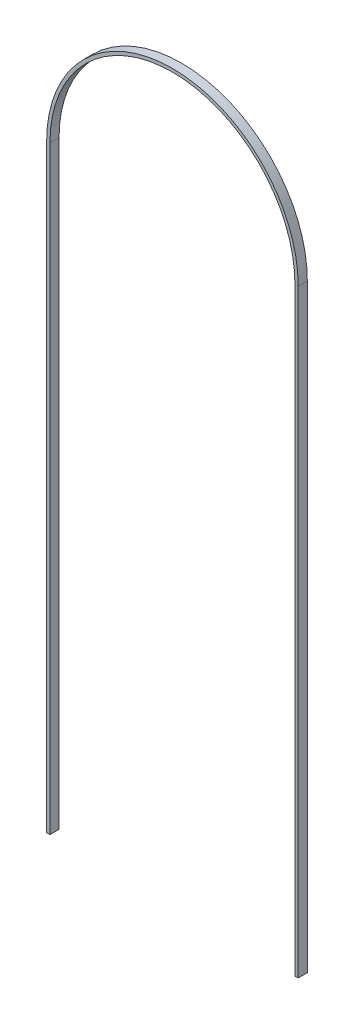
ISO-10303-21;
HEADER;
FILE_DESCRIPTION(('STEP AP214'),'2;1');
FILE_NAME('part.step','',(''),(''),'','','');
FILE_SCHEMA(('AUTOMOTIVE_DESIGN { 1 0 10303 214 1 1 1 1 }'));
ENDSEC;
DATA;
#1=APPLICATION_CONTEXT('core data for automotive mechanical design processes');
#2=APPLICATION_PROTOCOL_DEFINITION('international standard','automotive_design',2000,#1);
#3=PRODUCT_CONTEXT('',#1,'mechanical');
#4=PRODUCT('Part','Part','',(#3));
#5=PRODUCT_RELATED_PRODUCT_CATEGORY('part','',(#4));
#6=PRODUCT_DEFINITION_FORMATION('','',#4);
#7=PRODUCT_DEFINITION_CONTEXT('part definition',#1,'design');
#8=PRODUCT_DEFINITION('design','',#6,#7);
#9=PRODUCT_DEFINITION_SHAPE('','',#8);
#10=(LENGTH_UNIT() NAMED_UNIT(*) SI_UNIT(.MILLI.,.METRE.));
#11=(NAMED_UNIT(*) PLANE_ANGLE_UNIT() SI_UNIT($,.RADIAN.));
#12=(NAMED_UNIT(*) SI_UNIT($,.STERADIAN.) SOLID_ANGLE_UNIT());
#13=UNCERTAINTY_MEASURE_WITH_UNIT(LENGTH_MEASURE(1.E-05),#10,'distance_accuracy_value','');
#14=(GEOMETRIC_REPRESENTATION_CONTEXT(3) GLOBAL_UNCERTAINTY_ASSIGNED_CONTEXT((#13)) GLOBAL_UNIT_ASSIGNED_CONTEXT((#10,
#11,#12)) REPRESENTATION_CONTEXT('',''));
#15=CARTESIAN_POINT('',(0.,0.,0.));
#16=DIRECTION('',(0.,0.,1.));
#17=DIRECTION('',(1.,0.,0.));
#18=AXIS2_PLACEMENT_3D('',#15,#16,#17);
#19=CARTESIAN_POINT('',(0.,0.,70.));
#20=DIRECTION('',(0.,0.,-1.));
#21=DIRECTION('',(-1.,0.,0.));
#22=AXIS2_PLACEMENT_3D('',#19,#20,#21);
#23=CYLINDRICAL_SURFACE('',#22,940.);
#24=CARTESIAN_POINT('',(0.,0.,0.));
#25=DIRECTION('',(0.,0.,1.));
#26=DIRECTION('',(1.,0.,0.));
#27=AXIS2_PLACEMENT_3D('',#24,#25,#26);
#28=CIRCLE('',#27,940.);
#29=CARTESIAN_POINT('',(940.,0.,0.));
#30=VERTEX_POINT('',#29);
#31=CARTESIAN_POINT('',(-940.,1.15116799119851E-13,0.));
#32=VERTEX_POINT('',#31);
#33=EDGE_CURVE('E207',#30,#32,#28,.T.);
#34=ORIENTED_EDGE('',*,*,#33,.F.);
#35=DIRECTION('',(0.,0.,-1.));
#36=VECTOR('',#35,1.);
#37=CARTESIAN_POINT('',(940.,0.,70.));
#38=LINE('',#37,#36);
#39=CARTESIAN_POINT('',(940.,0.,70.));
#40=VERTEX_POINT('',#39);
#41=EDGE_CURVE('E13',#40,#30,#38,.T.);
#42=ORIENTED_EDGE('',*,*,#41,.F.);
#43=CARTESIAN_POINT('',(0.,0.,70.));
#44=DIRECTION('',(0.,0.,1.));
#45=DIRECTION('',(1.,0.,0.));
#46=AXIS2_PLACEMENT_3D('',#43,#44,#45);
#47=CIRCLE('',#46,940.);
#48=CARTESIAN_POINT('',(-940.,1.15116799119851E-13,70.));
#49=VERTEX_POINT('',#48);
#50=EDGE_CURVE('E223',#40,#49,#47,.T.);
#51=ORIENTED_EDGE('',*,*,#50,.T.);
#52=DIRECTION('',(0.,0.,-1.));
#53=VECTOR('',#52,1.);
#54=CARTESIAN_POINT('',(-940.,1.15116799119851E-13,70.));
#55=LINE('',#54,#53);
#56=EDGE_CURVE('E112',#49,#32,#55,.T.);
#57=ORIENTED_EDGE('',*,*,#56,.T.);
#58=EDGE_LOOP('',(#34,#42,#51,#57));
#59=FACE_BOUND('',#58,.T.);
#60=ADVANCED_FACE('F109',(#59),#23,.F.);
#61=CARTESIAN_POINT('',(940.,0.,70.));
#62=DIRECTION('',(1.,0.,0.));
#63=DIRECTION('',(0.,1.,0.));
#64=AXIS2_PLACEMENT_3D('',#61,#62,#63);
#65=PLANE('',#64);
#66=DIRECTION('',(0.,-1.,0.));
#67=VECTOR('',#66,1.);
#68=CARTESIAN_POINT('',(940.,0.,0.));
#69=LINE('',#68,#67);
#70=CARTESIAN_POINT('',(940.000000000001,-4597.,0.));
#71=VERTEX_POINT('',#70);
#72=EDGE_CURVE('E154',#30,#71,#69,.T.);
#73=ORIENTED_EDGE('',*,*,#72,.T.);
#74=DIRECTION('',(0.,0.,-1.));
#75=VECTOR('',#74,1.);
#76=CARTESIAN_POINT('',(940.000000000001,-4597.,70.));
#77=LINE('',#76,#75);
#78=CARTESIAN_POINT('',(940.000000000001,-4597.,70.));
#79=VERTEX_POINT('',#78);
#80=EDGE_CURVE('E118',#79,#71,#77,.T.);
#81=ORIENTED_EDGE('',*,*,#80,.F.);
#82=DIRECTION('',(0.,-1.,0.));
#83=VECTOR('',#82,1.);
#84=CARTESIAN_POINT('',(940.,0.,70.));
#85=LINE('',#84,#83);
#86=EDGE_CURVE('E185',#40,#79,#85,.T.);
#87=ORIENTED_EDGE('',*,*,#86,.F.);
#88=ORIENTED_EDGE('',*,*,#41,.T.);
#89=EDGE_LOOP('',(#73,#81,#87,#88));
#90=FACE_BOUND('',#89,.T.);
#91=ADVANCED_FACE('F263',(#90),#65,.F.);
#92=CARTESIAN_POINT('',(940.000000000001,-4597.,70.));
#93=DIRECTION('',(0.,1.,0.));
#94=DIRECTION('',(0.,0.,1.));
#95=AXIS2_PLACEMENT_3D('',#92,#93,#94);
#96=PLANE('',#95);
#97=DIRECTION('',(1.,0.,0.));
#98=VECTOR('',#97,1.);
#99=CARTESIAN_POINT('',(940.000000000001,-4597.,0.));
#100=LINE('',#99,#98);
#101=CARTESIAN_POINT('',(965.000000000001,-4597.,0.));
#102=VERTEX_POINT('',#101);
#103=EDGE_CURVE('E192',#71,#102,#100,.T.);
#104=ORIENTED_EDGE('',*,*,#103,.T.);
#105=DIRECTION('',(0.,0.,-1.));
#106=VECTOR('',#105,1.);
#107=CARTESIAN_POINT('',(965.000000000001,-4597.,70.));
#108=LINE('',#107,#106);
#109=CARTESIAN_POINT('',(965.000000000001,-4597.,70.));
#110=VERTEX_POINT('',#109);
#111=EDGE_CURVE('E189',#110,#102,#108,.T.);
#112=ORIENTED_EDGE('',*,*,#111,.F.);
#113=DIRECTION('',(1.,0.,0.));
#114=VECTOR('',#113,1.);
#115=CARTESIAN_POINT('',(940.000000000001,-4597.,70.));
#116=LINE('',#115,#114);
#117=EDGE_CURVE('E179',#79,#110,#116,.T.);
#118=ORIENTED_EDGE('',*,*,#117,.F.);
#119=ORIENTED_EDGE('',*,*,#80,.T.);
#120=EDGE_LOOP('',(#104,#112,#118,#119));
#121=FACE_BOUND('',#120,.T.);
#122=ADVANCED_FACE('F190',(#121),#96,.F.);
#123=CARTESIAN_POINT('',(965.,0.,70.));
#124=DIRECTION('',(1.,0.,0.));
#125=DIRECTION('',(0.,1.,0.));
#126=AXIS2_PLACEMENT_3D('',#123,#124,#125);
#127=PLANE('',#126);
#128=DIRECTION('',(0.,-1.,0.));
#129=VECTOR('',#128,1.);
#130=CARTESIAN_POINT('',(965.,0.,0.));
#131=LINE('',#130,#129);
#132=CARTESIAN_POINT('',(965.,0.,0.));
#133=VERTEX_POINT('',#132);
#134=EDGE_CURVE('E220',#133,#102,#131,.T.);
#135=ORIENTED_EDGE('',*,*,#134,.F.);
#136=DIRECTION('',(0.,0.,-1.));
#137=VECTOR('',#136,1.);
#138=CARTESIAN_POINT('',(965.,0.,70.));
#139=LINE('',#138,#137);
#140=CARTESIAN_POINT('',(965.,0.,70.));
#141=VERTEX_POINT('',#140);
#142=EDGE_CURVE('E196',#141,#133,#139,.T.);
#143=ORIENTED_EDGE('',*,*,#142,.F.);
#144=DIRECTION('',(0.,-1.,0.));
#145=VECTOR('',#144,1.);
#146=CARTESIAN_POINT('',(965.,0.,70.));
#147=LINE('',#146,#145);
#148=EDGE_CURVE('E184',#141,#110,#147,.T.);
#149=ORIENTED_EDGE('',*,*,#148,.T.);
#150=ORIENTED_EDGE('',*,*,#111,.T.);
#151=EDGE_LOOP('',(#135,#143,#149,#150));
#152=FACE_BOUND('',#151,.T.);
#153=ADVANCED_FACE('F198',(#152),#127,.T.);
#154=CARTESIAN_POINT('',(0.,0.,70.));
#155=DIRECTION('',(0.,0.,-1.));
#156=DIRECTION('',(-1.,0.,0.));
#157=AXIS2_PLACEMENT_3D('',#154,#155,#156);
#158=CYLINDRICAL_SURFACE('',#157,965.);
#159=CARTESIAN_POINT('',(0.,0.,0.));
#160=DIRECTION('',(0.,0.,1.));
#161=DIRECTION('',(1.,0.,0.));
#162=AXIS2_PLACEMENT_3D('',#159,#160,#161);
#163=CIRCLE('',#162,965.);
#164=CARTESIAN_POINT('',(-965.,1.1817841611772E-13,0.));
#165=VERTEX_POINT('',#164);
#166=EDGE_CURVE('E218',#133,#165,#163,.T.);
#167=ORIENTED_EDGE('',*,*,#166,.T.);
#168=DIRECTION('',(0.,0.,-1.));
#169=VECTOR('',#168,1.);
#170=CARTESIAN_POINT('',(-965.,1.1817841611772E-13,70.));
#171=LINE('',#170,#169);
#172=CARTESIAN_POINT('',(-965.,1.1817841611772E-13,70.));
#173=VERTEX_POINT('',#172);
#174=EDGE_CURVE('E227',#173,#165,#171,.T.);
#175=ORIENTED_EDGE('',*,*,#174,.F.);
#176=CARTESIAN_POINT('',(0.,0.,70.));
#177=DIRECTION('',(0.,0.,1.));
#178=DIRECTION('',(1.,0.,0.));
#179=AXIS2_PLACEMENT_3D('',#176,#177,#178);
#180=CIRCLE('',#179,965.);
#181=EDGE_CURVE('E200',#141,#173,#180,.T.);
#182=ORIENTED_EDGE('',*,*,#181,.F.);
#183=ORIENTED_EDGE('',*,*,#142,.T.);
#184=EDGE_LOOP('',(#167,#175,#182,#183));
#185=FACE_BOUND('',#184,.T.);
#186=ADVANCED_FACE('F242',(#185),#158,.T.);
#187=CARTESIAN_POINT('',(-965.,1.1817841611772E-13,70.));
#188=DIRECTION('',(1.,0.,0.));
#189=DIRECTION('',(0.,1.,0.));
#190=AXIS2_PLACEMENT_3D('',#187,#188,#189);
#191=PLANE('',#190);
#192=DIRECTION('',(0.,-1.,0.));
#193=VECTOR('',#192,1.);
#194=CARTESIAN_POINT('',(-965.,1.1817841611772E-13,0.));
#195=LINE('',#194,#193);
#196=CARTESIAN_POINT('',(-964.999999999999,-4597.,0.));
#197=VERTEX_POINT('',#196);
#198=EDGE_CURVE('E216',#165,#197,#195,.T.);
#199=ORIENTED_EDGE('',*,*,#198,.T.);
#200=DIRECTION('',(0.,0.,-1.));
#201=VECTOR('',#200,1.);
#202=CARTESIAN_POINT('',(-964.999999999999,-4597.,70.));
#203=LINE('',#202,#201);
#204=CARTESIAN_POINT('',(-964.999999999999,-4597.,70.));
#205=VERTEX_POINT('',#204);
#206=EDGE_CURVE('E230',#205,#197,#203,.T.);
#207=ORIENTED_EDGE('',*,*,#206,.F.);
#208=DIRECTION('',(0.,-1.,0.));
#209=VECTOR('',#208,1.);
#210=CARTESIAN_POINT('',(-965.,1.1817841611772E-13,70.));
#211=LINE('',#210,#209);
#212=EDGE_CURVE('E202',#173,#205,#211,.T.);
#213=ORIENTED_EDGE('',*,*,#212,.F.);
#214=ORIENTED_EDGE('',*,*,#174,.T.);
#215=EDGE_LOOP('',(#199,#207,#213,#214));
#216=FACE_BOUND('',#215,.T.);
#217=ADVANCED_FACE('F245',(#216),#191,.F.);
#218=CARTESIAN_POINT('',(-964.999999999999,-4597.,70.));
#219=DIRECTION('',(0.,1.,0.));
#220=DIRECTION('',(0.,0.,1.));
#221=AXIS2_PLACEMENT_3D('',#218,#219,#220);
#222=PLANE('',#221);
#223=DIRECTION('',(1.,0.,0.));
#224=VECTOR('',#223,1.);
#225=CARTESIAN_POINT('',(-964.999999999999,-4597.,0.));
#226=LINE('',#225,#224);
#227=CARTESIAN_POINT('',(-939.999999999999,-4597.,0.));
#228=VERTEX_POINT('',#227);
#229=EDGE_CURVE('E213',#197,#228,#226,.T.);
#230=ORIENTED_EDGE('',*,*,#229,.T.);
#231=DIRECTION('',(0.,0.,-1.));
#232=VECTOR('',#231,1.);
#233=CARTESIAN_POINT('',(-939.999999999999,-4597.,70.));
#234=LINE('',#233,#232);
#235=CARTESIAN_POINT('',(-939.999999999999,-4597.,70.));
#236=VERTEX_POINT('',#235);
#237=EDGE_CURVE('E232',#236,#228,#234,.T.);
#238=ORIENTED_EDGE('',*,*,#237,.F.);
#239=DIRECTION('',(1.,0.,0.));
#240=VECTOR('',#239,1.);
#241=CARTESIAN_POINT('',(-964.999999999999,-4597.,70.));
#242=LINE('',#241,#240);
#243=EDGE_CURVE('E248',#205,#236,#242,.T.);
#244=ORIENTED_EDGE('',*,*,#243,.F.);
#245=ORIENTED_EDGE('',*,*,#206,.T.);
#246=EDGE_LOOP('',(#230,#238,#244,#245));
#247=FACE_BOUND('',#246,.T.);
#248=ADVANCED_FACE('F254',(#247),#222,.F.);
#249=CARTESIAN_POINT('',(-940.,1.15116799119851E-13,70.));
#250=DIRECTION('',(1.,0.,0.));
#251=DIRECTION('',(0.,1.,0.));
#252=AXIS2_PLACEMENT_3D('',#249,#250,#251);
#253=PLANE('',#252);
#254=DIRECTION('',(0.,-1.,0.));
#255=VECTOR('',#254,1.);
#256=CARTESIAN_POINT('',(-940.,1.15116799119851E-13,0.));
#257=LINE('',#256,#255);
#258=EDGE_CURVE('E210',#32,#228,#257,.T.);
#259=ORIENTED_EDGE('',*,*,#258,.F.);
#260=ORIENTED_EDGE('',*,*,#56,.F.);
#261=DIRECTION('',(0.,-1.,0.));
#262=VECTOR('',#261,1.);
#263=CARTESIAN_POINT('',(-940.,1.15116799119851E-13,70.));
#264=LINE('',#263,#262);
#265=EDGE_CURVE('E249',#49,#236,#264,.T.);
#266=ORIENTED_EDGE('',*,*,#265,.T.);
#267=ORIENTED_EDGE('',*,*,#237,.T.);
#268=EDGE_LOOP('',(#259,#260,#266,#267));
#269=FACE_BOUND('',#268,.T.);
#270=ADVANCED_FACE('F234',(#269),#253,.T.);
#271=CARTESIAN_POINT('',(0.,0.,70.));
#272=DIRECTION('',(0.,0.,1.));
#273=DIRECTION('',(1.,0.,0.));
#274=AXIS2_PLACEMENT_3D('',#271,#272,#273);
#275=PLANE('',#274);
#276=ORIENTED_EDGE('',*,*,#50,.F.);
#277=ORIENTED_EDGE('',*,*,#86,.T.);
#278=ORIENTED_EDGE('',*,*,#117,.T.);
#279=ORIENTED_EDGE('',*,*,#148,.F.);
#280=ORIENTED_EDGE('',*,*,#181,.T.);
#281=ORIENTED_EDGE('',*,*,#212,.T.);
#282=ORIENTED_EDGE('',*,*,#243,.T.);
#283=ORIENTED_EDGE('',*,*,#265,.F.);
#284=EDGE_LOOP('',(#276,#277,#278,#279,#280,#281,#282,#283));
#285=FACE_BOUND('',#284,.T.);
#286=ADVANCED_FACE('F182',(#285),#275,.T.);
#287=CARTESIAN_POINT('',(0.,0.,0.));
#288=DIRECTION('',(0.,0.,1.));
#289=DIRECTION('',(1.,0.,0.));
#290=AXIS2_PLACEMENT_3D('',#287,#288,#289);
#291=PLANE('',#290);
#292=ORIENTED_EDGE('',*,*,#33,.T.);
#293=ORIENTED_EDGE('',*,*,#258,.T.);
#294=ORIENTED_EDGE('',*,*,#229,.F.);
#295=ORIENTED_EDGE('',*,*,#198,.F.);
#296=ORIENTED_EDGE('',*,*,#166,.F.);
#297=ORIENTED_EDGE('',*,*,#134,.T.);
#298=ORIENTED_EDGE('',*,*,#103,.F.);
#299=ORIENTED_EDGE('',*,*,#72,.F.);
#300=EDGE_LOOP('',(#292,#293,#294,#295,#296,#297,#298,#299));
#301=FACE_BOUND('',#300,.T.);
#302=ADVANCED_FACE('F237',(#301),#291,.F.);
#303=CLOSED_SHELL('',(#60,#91,#122,#153,#186,#217,#248,#270,#286,#302));
#304=MANIFOLD_SOLID_BREP('B2',#303);
#305=ADVANCED_BREP_SHAPE_REPRESENTATION('',(#18,#304),#14);
#306=SHAPE_DEFINITION_REPRESENTATION(#9,#305);
ENDSEC;
END-ISO-10303-21;
